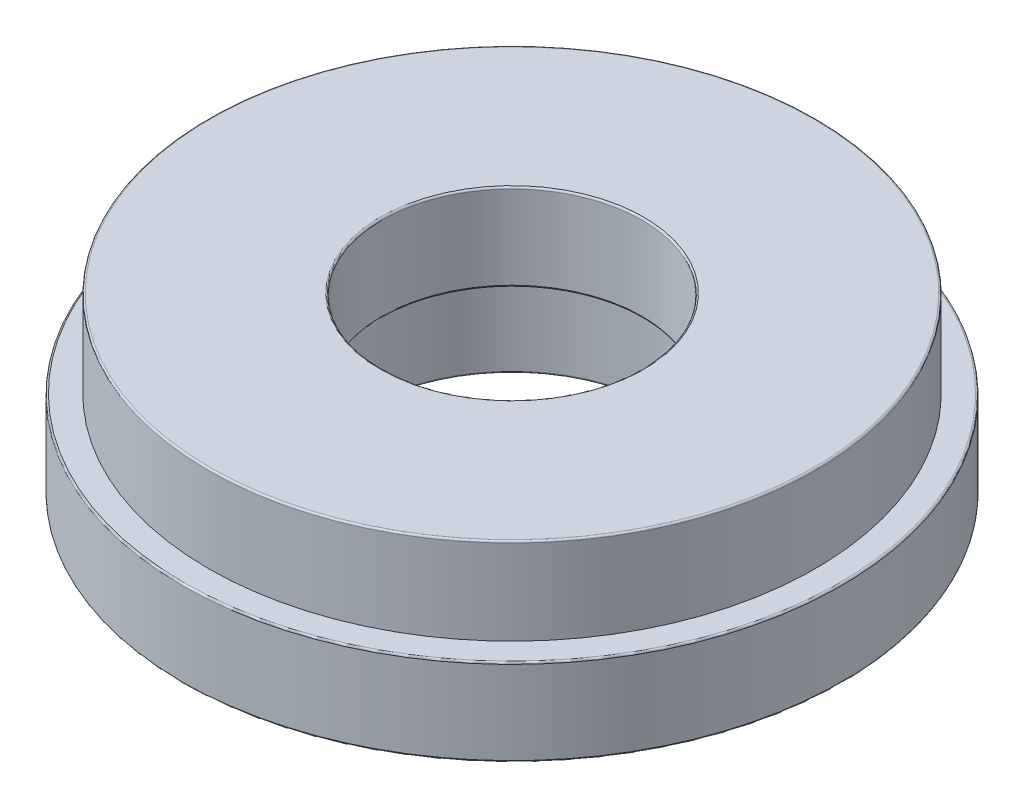
ISO-10303-21;
HEADER;
FILE_DESCRIPTION(('STEP AP214'),'2;1');
FILE_NAME('part.step','',(''),(''),'','','');
FILE_SCHEMA(('AUTOMOTIVE_DESIGN { 1 0 10303 214 1 1 1 1 }'));
ENDSEC;
DATA;
#1=APPLICATION_CONTEXT('core data for automotive mechanical design processes');
#2=APPLICATION_PROTOCOL_DEFINITION('international standard','automotive_design',2000,#1);
#3=PRODUCT_CONTEXT('',#1,'mechanical');
#4=PRODUCT('Part','Part','',(#3));
#5=PRODUCT_RELATED_PRODUCT_CATEGORY('part','',(#4));
#6=PRODUCT_DEFINITION_FORMATION('','',#4);
#7=PRODUCT_DEFINITION_CONTEXT('part definition',#1,'design');
#8=PRODUCT_DEFINITION('design','',#6,#7);
#9=PRODUCT_DEFINITION_SHAPE('','',#8);
#10=(LENGTH_UNIT() NAMED_UNIT(*) SI_UNIT(.MILLI.,.METRE.));
#11=(NAMED_UNIT(*) PLANE_ANGLE_UNIT() SI_UNIT($,.RADIAN.));
#12=(NAMED_UNIT(*) SI_UNIT($,.STERADIAN.) SOLID_ANGLE_UNIT());
#13=UNCERTAINTY_MEASURE_WITH_UNIT(LENGTH_MEASURE(1.E-05),#10,'distance_accuracy_value','');
#14=(GEOMETRIC_REPRESENTATION_CONTEXT(3) GLOBAL_UNCERTAINTY_ASSIGNED_CONTEXT((#13)) GLOBAL_UNIT_ASSIGNED_CONTEXT((#10,
#11,#12)) REPRESENTATION_CONTEXT('',''));
#15=CARTESIAN_POINT('',(0.,0.,0.));
#16=DIRECTION('',(0.,0.,1.));
#17=DIRECTION('',(1.,0.,0.));
#18=AXIS2_PLACEMENT_3D('',#15,#16,#17);
#19=CARTESIAN_POINT('',(0.,5.,0.));
#20=DIRECTION('',(0.,-1.,0.));
#21=DIRECTION('',(0.,0.,-1.));
#22=AXIS2_PLACEMENT_3D('',#19,#20,#21);
#23=CYLINDRICAL_SURFACE('',#22,19.);
#24=CARTESIAN_POINT('',(0.,0.1,0.));
#25=DIRECTION('',(0.,1.,0.));
#26=DIRECTION('',(0.,0.,1.));
#27=AXIS2_PLACEMENT_3D('',#24,#25,#26);
#28=CIRCLE('',#27,19.);
#29=CARTESIAN_POINT('',(0.,0.1,19.));
#30=VERTEX_POINT('',#29);
#31=EDGE_CURVE('E44',#30,#30,#28,.T.);
#32=ORIENTED_EDGE('',*,*,#31,.T.);
#33=EDGE_LOOP('',(#32));
#34=FACE_BOUND('',#33,.T.);
#35=CARTESIAN_POINT('',(0.,4.9,0.));
#36=DIRECTION('',(0.,1.,0.));
#37=DIRECTION('',(0.,0.,1.));
#38=AXIS2_PLACEMENT_3D('',#35,#36,#37);
#39=CIRCLE('',#38,19.);
#40=CARTESIAN_POINT('',(0.,4.9,19.));
#41=VERTEX_POINT('',#40);
#42=EDGE_CURVE('E48',#41,#41,#39,.F.);
#43=ORIENTED_EDGE('',*,*,#42,.T.);
#44=EDGE_LOOP('',(#43));
#45=FACE_BOUND('',#44,.T.);
#46=ADVANCED_FACE('F37',(#34,#45),#23,.T.);
#47=CARTESIAN_POINT('',(0.,5.,0.));
#48=DIRECTION('',(0.,1.,0.));
#49=DIRECTION('',(0.,0.,1.));
#50=AXIS2_PLACEMENT_3D('',#47,#48,#49);
#51=PLANE('',#50);
#52=CARTESIAN_POINT('',(0.,5.,0.));
#53=DIRECTION('',(0.,1.,0.));
#54=DIRECTION('',(0.,0.,1.));
#55=AXIS2_PLACEMENT_3D('',#52,#53,#54);
#56=CIRCLE('',#55,18.9);
#57=CARTESIAN_POINT('',(0.,5.,18.9));
#58=VERTEX_POINT('',#57);
#59=EDGE_CURVE('E11',#58,#58,#56,.T.);
#60=ORIENTED_EDGE('',*,*,#59,.T.);
#61=EDGE_LOOP('',(#60));
#62=FACE_BOUND('',#61,.T.);
#63=CARTESIAN_POINT('',(0.,5.,0.));
#64=DIRECTION('',(0.,1.,0.));
#65=DIRECTION('',(0.,0.,1.));
#66=AXIS2_PLACEMENT_3D('',#63,#64,#65);
#67=CIRCLE('',#66,17.5);
#68=CARTESIAN_POINT('',(0.,5.,17.5));
#69=VERTEX_POINT('',#68);
#70=EDGE_CURVE('E125',#69,#69,#67,.T.);
#71=ORIENTED_EDGE('',*,*,#70,.F.);
#72=EDGE_LOOP('',(#71));
#73=FACE_BOUND('',#72,.T.);
#74=ADVANCED_FACE('F160',(#62,#73),#51,.T.);
#75=CARTESIAN_POINT('',(0.,0.,0.));
#76=DIRECTION('',(0.,1.,0.));
#77=DIRECTION('',(0.,0.,1.));
#78=AXIS2_PLACEMENT_3D('',#75,#76,#77);
#79=PLANE('',#78);
#80=CARTESIAN_POINT('',(-12.9903810567666,0.,-7.49999999999999));
#81=DIRECTION('',(0.,1.,0.));
#82=DIRECTION('',(0.,0.,1.));
#83=AXIS2_PLACEMENT_3D('',#80,#81,#82);
#84=CIRCLE('',#83,3.2);
#85=CARTESIAN_POINT('',(-12.9903810567666,0.,-4.29999999999999));
#86=VERTEX_POINT('',#85);
#87=EDGE_CURVE('E84',#86,#86,#84,.T.);
#88=ORIENTED_EDGE('',*,*,#87,.T.);
#89=EDGE_LOOP('',(#88));
#90=FACE_BOUND('',#89,.T.);
#91=CARTESIAN_POINT('',(-12.9903810567666,0.,7.50000000000001));
#92=DIRECTION('',(0.,1.,0.));
#93=DIRECTION('',(0.,0.,1.));
#94=AXIS2_PLACEMENT_3D('',#91,#92,#93);
#95=CIRCLE('',#94,3.2);
#96=CARTESIAN_POINT('',(-12.9903810567666,0.,10.7));
#97=VERTEX_POINT('',#96);
#98=EDGE_CURVE('E87',#97,#97,#95,.T.);
#99=ORIENTED_EDGE('',*,*,#98,.T.);
#100=EDGE_LOOP('',(#99));
#101=FACE_BOUND('',#100,.T.);
#102=CARTESIAN_POINT('',(0.,0.,15.));
#103=DIRECTION('',(0.,1.,0.));
#104=DIRECTION('',(0.,0.,1.));
#105=AXIS2_PLACEMENT_3D('',#102,#103,#104);
#106=CIRCLE('',#105,3.2);
#107=CARTESIAN_POINT('',(0.,0.,18.2));
#108=VERTEX_POINT('',#107);
#109=EDGE_CURVE('E90',#108,#108,#106,.T.);
#110=ORIENTED_EDGE('',*,*,#109,.T.);
#111=EDGE_LOOP('',(#110));
#112=FACE_BOUND('',#111,.T.);
#113=CARTESIAN_POINT('',(12.9903810567666,0.,7.5));
#114=DIRECTION('',(0.,1.,0.));
#115=DIRECTION('',(0.,0.,1.));
#116=AXIS2_PLACEMENT_3D('',#113,#114,#115);
#117=CIRCLE('',#116,3.2);
#118=CARTESIAN_POINT('',(12.9903810567666,0.,10.7));
#119=VERTEX_POINT('',#118);
#120=EDGE_CURVE('E93',#119,#119,#117,.T.);
#121=ORIENTED_EDGE('',*,*,#120,.T.);
#122=EDGE_LOOP('',(#121));
#123=FACE_BOUND('',#122,.T.);
#124=CARTESIAN_POINT('',(12.9903810567666,0.,-7.50000000000001));
#125=DIRECTION('',(0.,1.,0.));
#126=DIRECTION('',(0.,0.,1.));
#127=AXIS2_PLACEMENT_3D('',#124,#125,#126);
#128=CIRCLE('',#127,3.2);
#129=CARTESIAN_POINT('',(12.9903810567666,0.,-4.30000000000001));
#130=VERTEX_POINT('',#129);
#131=EDGE_CURVE('E96',#130,#130,#128,.T.);
#132=ORIENTED_EDGE('',*,*,#131,.T.);
#133=EDGE_LOOP('',(#132));
#134=FACE_BOUND('',#133,.T.);
#135=CARTESIAN_POINT('',(0.,0.,-15.));
#136=DIRECTION('',(0.,1.,0.));
#137=DIRECTION('',(0.,0.,1.));
#138=AXIS2_PLACEMENT_3D('',#135,#136,#137);
#139=CIRCLE('',#138,3.2);
#140=CARTESIAN_POINT('',(0.,0.,-11.8));
#141=VERTEX_POINT('',#140);
#142=EDGE_CURVE('E99',#141,#141,#139,.T.);
#143=ORIENTED_EDGE('',*,*,#142,.T.);
#144=EDGE_LOOP('',(#143));
#145=FACE_BOUND('',#144,.T.);
#146=CARTESIAN_POINT('',(0.,0.,0.));
#147=DIRECTION('',(0.,1.,0.));
#148=DIRECTION('',(0.,0.,1.));
#149=AXIS2_PLACEMENT_3D('',#146,#147,#148);
#150=CIRCLE('',#149,8.6);
#151=CARTESIAN_POINT('',(0.,0.,8.6));
#152=VERTEX_POINT('',#151);
#153=EDGE_CURVE('E102',#152,#152,#150,.T.);
#154=ORIENTED_EDGE('',*,*,#153,.T.);
#155=EDGE_LOOP('',(#154));
#156=FACE_BOUND('',#155,.T.);
#157=CARTESIAN_POINT('',(0.,0.,0.));
#158=DIRECTION('',(0.,1.,0.));
#159=DIRECTION('',(0.,0.,1.));
#160=AXIS2_PLACEMENT_3D('',#157,#158,#159);
#161=CIRCLE('',#160,18.9);
#162=CARTESIAN_POINT('',(0.,0.,18.9));
#163=VERTEX_POINT('',#162);
#164=EDGE_CURVE('E105',#163,#163,#161,.F.);
#165=ORIENTED_EDGE('',*,*,#164,.T.);
#166=EDGE_LOOP('',(#165));
#167=FACE_BOUND('',#166,.T.);
#168=ADVANCED_FACE('F165',(#90,#101,#112,#123,#134,#145,#156,#167),#79,.F.);
#169=CARTESIAN_POINT('',(-12.9903810567666,4.,-7.49999999999999));
#170=DIRECTION('',(0.,-1.,0.));
#171=DIRECTION('',(0.,0.,-1.));
#172=AXIS2_PLACEMENT_3D('',#169,#170,#171);
#173=CYLINDRICAL_SURFACE('',#172,3.1);
#174=CARTESIAN_POINT('',(-12.9903810567666,0.0999999999999998,-7.49999999999999));
#175=DIRECTION('',(0.,1.,0.));
#176=DIRECTION('',(0.,0.,1.));
#177=AXIS2_PLACEMENT_3D('',#174,#175,#176);
#178=CIRCLE('',#177,3.1);
#179=CARTESIAN_POINT('',(-12.9903810567666,0.0999999999999998,-4.39999999999999));
#180=VERTEX_POINT('',#179);
#181=EDGE_CURVE('E81',#180,#180,#178,.F.);
#182=ORIENTED_EDGE('',*,*,#181,.T.);
#183=EDGE_LOOP('',(#182));
#184=FACE_BOUND('',#183,.T.);
#185=CARTESIAN_POINT('',(-12.9903810567666,4.,-7.49999999999999));
#186=DIRECTION('',(0.,1.,0.));
#187=DIRECTION('',(0.,0.,1.));
#188=AXIS2_PLACEMENT_3D('',#185,#186,#187);
#189=CIRCLE('',#188,3.1);
#190=CARTESIAN_POINT('',(-12.9903810567666,4.,-4.39999999999999));
#191=VERTEX_POINT('',#190);
#192=EDGE_CURVE('E117',#191,#191,#189,.T.);
#193=ORIENTED_EDGE('',*,*,#192,.T.);
#194=EDGE_LOOP('',(#193));
#195=FACE_BOUND('',#194,.T.);
#196=ADVANCED_FACE('F215',(#184,#195),#173,.F.);
#197=CARTESIAN_POINT('',(0.,4.,0.));
#198=DIRECTION('',(0.,1.,0.));
#199=DIRECTION('',(0.,0.,1.));
#200=AXIS2_PLACEMENT_3D('',#197,#198,#199);
#201=PLANE('',#200);
#202=ORIENTED_EDGE('',*,*,#192,.F.);
#203=EDGE_LOOP('',(#202));
#204=FACE_BOUND('',#203,.T.);
#205=ADVANCED_FACE('F220',(#204),#201,.F.);
#206=CARTESIAN_POINT('',(-12.9903810567666,4.,7.50000000000001));
#207=DIRECTION('',(0.,-1.,0.));
#208=DIRECTION('',(0.,0.,-1.));
#209=AXIS2_PLACEMENT_3D('',#206,#207,#208);
#210=CYLINDRICAL_SURFACE('',#209,3.1);
#211=CARTESIAN_POINT('',(-12.9903810567666,0.0999999999999998,7.50000000000001));
#212=DIRECTION('',(0.,1.,0.));
#213=DIRECTION('',(0.,0.,1.));
#214=AXIS2_PLACEMENT_3D('',#211,#212,#213);
#215=CIRCLE('',#214,3.1);
#216=CARTESIAN_POINT('',(-12.9903810567666,0.0999999999999998,10.6));
#217=VERTEX_POINT('',#216);
#218=EDGE_CURVE('E78',#217,#217,#215,.F.);
#219=ORIENTED_EDGE('',*,*,#218,.T.);
#220=EDGE_LOOP('',(#219));
#221=FACE_BOUND('',#220,.T.);
#222=CARTESIAN_POINT('',(-12.9903810567666,4.,7.50000000000001));
#223=DIRECTION('',(0.,1.,0.));
#224=DIRECTION('',(0.,0.,1.));
#225=AXIS2_PLACEMENT_3D('',#222,#223,#224);
#226=CIRCLE('',#225,3.1);
#227=CARTESIAN_POINT('',(-12.9903810567666,4.,10.6));
#228=VERTEX_POINT('',#227);
#229=EDGE_CURVE('E120',#228,#228,#226,.T.);
#230=ORIENTED_EDGE('',*,*,#229,.T.);
#231=EDGE_LOOP('',(#230));
#232=FACE_BOUND('',#231,.T.);
#233=ADVANCED_FACE('F247',(#221,#232),#210,.F.);
#234=CARTESIAN_POINT('',(0.,4.,0.));
#235=DIRECTION('',(0.,1.,0.));
#236=DIRECTION('',(0.,0.,1.));
#237=AXIS2_PLACEMENT_3D('',#234,#235,#236);
#238=PLANE('',#237);
#239=ORIENTED_EDGE('',*,*,#229,.F.);
#240=EDGE_LOOP('',(#239));
#241=FACE_BOUND('',#240,.T.);
#242=ADVANCED_FACE('F281',(#241),#238,.F.);
#243=CARTESIAN_POINT('',(0.,4.,15.));
#244=DIRECTION('',(0.,-1.,0.));
#245=DIRECTION('',(0.,0.,-1.));
#246=AXIS2_PLACEMENT_3D('',#243,#244,#245);
#247=CYLINDRICAL_SURFACE('',#246,3.1);
#248=CARTESIAN_POINT('',(0.,0.0999999999999998,15.));
#249=DIRECTION('',(0.,1.,0.));
#250=DIRECTION('',(0.,0.,1.));
#251=AXIS2_PLACEMENT_3D('',#248,#249,#250);
#252=CIRCLE('',#251,3.1);
#253=CARTESIAN_POINT('',(0.,0.0999999999999998,18.1));
#254=VERTEX_POINT('',#253);
#255=EDGE_CURVE('E75',#254,#254,#252,.F.);
#256=ORIENTED_EDGE('',*,*,#255,.T.);
#257=EDGE_LOOP('',(#256));
#258=FACE_BOUND('',#257,.T.);
#259=CARTESIAN_POINT('',(0.,4.,15.));
#260=DIRECTION('',(0.,1.,0.));
#261=DIRECTION('',(0.,0.,1.));
#262=AXIS2_PLACEMENT_3D('',#259,#260,#261);
#263=CIRCLE('',#262,3.1);
#264=CARTESIAN_POINT('',(0.,4.,18.1));
#265=VERTEX_POINT('',#264);
#266=EDGE_CURVE('E131',#265,#265,#263,.T.);
#267=ORIENTED_EDGE('',*,*,#266,.T.);
#268=EDGE_LOOP('',(#267));
#269=FACE_BOUND('',#268,.T.);
#270=ADVANCED_FACE('F278',(#258,#269),#247,.F.);
#271=CARTESIAN_POINT('',(0.,4.,0.));
#272=DIRECTION('',(0.,1.,0.));
#273=DIRECTION('',(0.,0.,1.));
#274=AXIS2_PLACEMENT_3D('',#271,#272,#273);
#275=PLANE('',#274);
#276=ORIENTED_EDGE('',*,*,#266,.F.);
#277=EDGE_LOOP('',(#276));
#278=FACE_BOUND('',#277,.T.);
#279=ADVANCED_FACE('F273',(#278),#275,.F.);
#280=CARTESIAN_POINT('',(12.9903810567666,4.,7.5));
#281=DIRECTION('',(0.,-1.,0.));
#282=DIRECTION('',(0.,0.,-1.));
#283=AXIS2_PLACEMENT_3D('',#280,#281,#282);
#284=CYLINDRICAL_SURFACE('',#283,3.1);
#285=CARTESIAN_POINT('',(12.9903810567666,0.0999999999999998,7.5));
#286=DIRECTION('',(0.,1.,0.));
#287=DIRECTION('',(0.,0.,1.));
#288=AXIS2_PLACEMENT_3D('',#285,#286,#287);
#289=CIRCLE('',#288,3.1);
#290=CARTESIAN_POINT('',(12.9903810567666,0.0999999999999998,10.6));
#291=VERTEX_POINT('',#290);
#292=EDGE_CURVE('E72',#291,#291,#289,.F.);
#293=ORIENTED_EDGE('',*,*,#292,.T.);
#294=EDGE_LOOP('',(#293));
#295=FACE_BOUND('',#294,.T.);
#296=CARTESIAN_POINT('',(12.9903810567666,4.,7.5));
#297=DIRECTION('',(0.,1.,0.));
#298=DIRECTION('',(0.,0.,1.));
#299=AXIS2_PLACEMENT_3D('',#296,#297,#298);
#300=CIRCLE('',#299,3.1);
#301=CARTESIAN_POINT('',(12.9903810567666,4.,10.6));
#302=VERTEX_POINT('',#301);
#303=EDGE_CURVE('E128',#302,#302,#300,.T.);
#304=ORIENTED_EDGE('',*,*,#303,.T.);
#305=EDGE_LOOP('',(#304));
#306=FACE_BOUND('',#305,.T.);
#307=ADVANCED_FACE('F270',(#295,#306),#284,.F.);
#308=CARTESIAN_POINT('',(0.,4.,0.));
#309=DIRECTION('',(0.,1.,0.));
#310=DIRECTION('',(0.,0.,1.));
#311=AXIS2_PLACEMENT_3D('',#308,#309,#310);
#312=PLANE('',#311);
#313=ORIENTED_EDGE('',*,*,#303,.F.);
#314=EDGE_LOOP('',(#313));
#315=FACE_BOUND('',#314,.T.);
#316=ADVANCED_FACE('F265',(#315),#312,.F.);
#317=CARTESIAN_POINT('',(12.9903810567666,4.,-7.50000000000001));
#318=DIRECTION('',(0.,-1.,0.));
#319=DIRECTION('',(0.,0.,-1.));
#320=AXIS2_PLACEMENT_3D('',#317,#318,#319);
#321=CYLINDRICAL_SURFACE('',#320,3.1);
#322=CARTESIAN_POINT('',(12.9903810567666,0.0999999999999998,-7.50000000000001));
#323=DIRECTION('',(0.,1.,0.));
#324=DIRECTION('',(0.,0.,1.));
#325=AXIS2_PLACEMENT_3D('',#322,#323,#324);
#326=CIRCLE('',#325,3.1);
#327=CARTESIAN_POINT('',(12.9903810567666,0.0999999999999998,-4.4));
#328=VERTEX_POINT('',#327);
#329=EDGE_CURVE('E69',#328,#328,#326,.F.);
#330=ORIENTED_EDGE('',*,*,#329,.T.);
#331=EDGE_LOOP('',(#330));
#332=FACE_BOUND('',#331,.T.);
#333=CARTESIAN_POINT('',(12.9903810567666,4.,-7.50000000000001));
#334=DIRECTION('',(0.,1.,0.));
#335=DIRECTION('',(0.,0.,1.));
#336=AXIS2_PLACEMENT_3D('',#333,#334,#335);
#337=CIRCLE('',#336,3.1);
#338=CARTESIAN_POINT('',(12.9903810567666,4.,-4.4));
#339=VERTEX_POINT('',#338);
#340=EDGE_CURVE('E124',#339,#339,#337,.T.);
#341=ORIENTED_EDGE('',*,*,#340,.T.);
#342=EDGE_LOOP('',(#341));
#343=FACE_BOUND('',#342,.T.);
#344=ADVANCED_FACE('F262',(#332,#343),#321,.F.);
#345=CARTESIAN_POINT('',(0.,4.,0.));
#346=DIRECTION('',(0.,1.,0.));
#347=DIRECTION('',(0.,0.,1.));
#348=AXIS2_PLACEMENT_3D('',#345,#346,#347);
#349=PLANE('',#348);
#350=ORIENTED_EDGE('',*,*,#340,.F.);
#351=EDGE_LOOP('',(#350));
#352=FACE_BOUND('',#351,.T.);
#353=ADVANCED_FACE('F256',(#352),#349,.F.);
#354=CARTESIAN_POINT('',(0.,4.,-15.));
#355=DIRECTION('',(0.,-1.,0.));
#356=DIRECTION('',(0.,0.,-1.));
#357=AXIS2_PLACEMENT_3D('',#354,#355,#356);
#358=CYLINDRICAL_SURFACE('',#357,3.1);
#359=CARTESIAN_POINT('',(0.,0.0999999999999998,-15.));
#360=DIRECTION('',(0.,1.,0.));
#361=DIRECTION('',(0.,0.,1.));
#362=AXIS2_PLACEMENT_3D('',#359,#360,#361);
#363=CIRCLE('',#362,3.1);
#364=CARTESIAN_POINT('',(0.,0.0999999999999998,-11.9));
#365=VERTEX_POINT('',#364);
#366=EDGE_CURVE('E66',#365,#365,#363,.F.);
#367=ORIENTED_EDGE('',*,*,#366,.T.);
#368=EDGE_LOOP('',(#367));
#369=FACE_BOUND('',#368,.T.);
#370=CARTESIAN_POINT('',(0.,4.,-15.));
#371=DIRECTION('',(0.,1.,0.));
#372=DIRECTION('',(0.,0.,1.));
#373=AXIS2_PLACEMENT_3D('',#370,#371,#372);
#374=CIRCLE('',#373,3.1);
#375=CARTESIAN_POINT('',(0.,4.,-11.9));
#376=VERTEX_POINT('',#375);
#377=EDGE_CURVE('E121',#376,#376,#374,.T.);
#378=ORIENTED_EDGE('',*,*,#377,.T.);
#379=EDGE_LOOP('',(#378));
#380=FACE_BOUND('',#379,.T.);
#381=ADVANCED_FACE('F252',(#369,#380),#358,.F.);
#382=CARTESIAN_POINT('',(0.,4.,0.));
#383=DIRECTION('',(0.,1.,0.));
#384=DIRECTION('',(0.,0.,1.));
#385=AXIS2_PLACEMENT_3D('',#382,#383,#384);
#386=PLANE('',#385);
#387=ORIENTED_EDGE('',*,*,#377,.F.);
#388=EDGE_LOOP('',(#387));
#389=FACE_BOUND('',#388,.T.);
#390=ADVANCED_FACE('F255',(#389),#386,.F.);
#391=CARTESIAN_POINT('',(0.,10.,0.));
#392=DIRECTION('',(0.,1.,0.));
#393=DIRECTION('',(0.,0.,1.));
#394=AXIS2_PLACEMENT_3D('',#391,#392,#393);
#395=PLANE('',#394);
#396=CARTESIAN_POINT('',(0.,10.,0.));
#397=DIRECTION('',(0.,1.,0.));
#398=DIRECTION('',(0.,0.,1.));
#399=AXIS2_PLACEMENT_3D('',#396,#397,#398);
#400=CIRCLE('',#399,7.6);
#401=CARTESIAN_POINT('',(0.,10.,7.6));
#402=VERTEX_POINT('',#401);
#403=EDGE_CURVE('E57',#402,#402,#400,.F.);
#404=ORIENTED_EDGE('',*,*,#403,.T.);
#405=EDGE_LOOP('',(#404));
#406=FACE_BOUND('',#405,.T.);
#407=CARTESIAN_POINT('',(0.,10.,0.));
#408=DIRECTION('',(0.,1.,0.));
#409=DIRECTION('',(0.,0.,1.));
#410=AXIS2_PLACEMENT_3D('',#407,#408,#409);
#411=CIRCLE('',#410,17.4);
#412=CARTESIAN_POINT('',(0.,10.,17.4));
#413=VERTEX_POINT('',#412);
#414=EDGE_CURVE('E60',#413,#413,#411,.T.);
#415=ORIENTED_EDGE('',*,*,#414,.T.);
#416=EDGE_LOOP('',(#415));
#417=FACE_BOUND('',#416,.T.);
#418=ADVANCED_FACE('F260',(#406,#417),#395,.T.);
#419=CARTESIAN_POINT('',(0.,10.,0.));
#420=DIRECTION('',(0.,-1.,0.));
#421=DIRECTION('',(0.,0.,-1.));
#422=AXIS2_PLACEMENT_3D('',#419,#420,#421);
#423=CYLINDRICAL_SURFACE('',#422,17.5);
#424=CARTESIAN_POINT('',(0.,9.9,0.));
#425=DIRECTION('',(0.,1.,0.));
#426=DIRECTION('',(0.,0.,1.));
#427=AXIS2_PLACEMENT_3D('',#424,#425,#426);
#428=CIRCLE('',#427,17.5);
#429=CARTESIAN_POINT('',(0.,9.9,17.5));
#430=VERTEX_POINT('',#429);
#431=EDGE_CURVE('E52',#430,#430,#428,.F.);
#432=ORIENTED_EDGE('',*,*,#431,.T.);
#433=EDGE_LOOP('',(#432));
#434=FACE_BOUND('',#433,.T.);
#435=ORIENTED_EDGE('',*,*,#70,.T.);
#436=EDGE_LOOP('',(#435));
#437=FACE_BOUND('',#436,.T.);
#438=ADVANCED_FACE('F292',(#434,#437),#423,.T.);
#439=CARTESIAN_POINT('',(0.,10.,0.));
#440=DIRECTION('',(0.,-1.,0.));
#441=DIRECTION('',(0.,0.,-1.));
#442=AXIS2_PLACEMENT_3D('',#439,#440,#441);
#443=CYLINDRICAL_SURFACE('',#442,7.5);
#444=CARTESIAN_POINT('',(0.,5.1,0.));
#445=DIRECTION('',(0.,1.,0.));
#446=DIRECTION('',(0.,0.,1.));
#447=AXIS2_PLACEMENT_3D('',#444,#445,#446);
#448=CIRCLE('',#447,7.5);
#449=CARTESIAN_POINT('',(0.,5.1,7.5));
#450=VERTEX_POINT('',#449);
#451=EDGE_CURVE('E111',#450,#450,#448,.F.);
#452=ORIENTED_EDGE('',*,*,#451,.T.);
#453=EDGE_LOOP('',(#452));
#454=FACE_BOUND('',#453,.T.);
#455=CARTESIAN_POINT('',(0.,9.9,0.));
#456=DIRECTION('',(0.,1.,0.));
#457=DIRECTION('',(0.,0.,1.));
#458=AXIS2_PLACEMENT_3D('',#455,#456,#457);
#459=CIRCLE('',#458,7.5);
#460=CARTESIAN_POINT('',(0.,9.9,7.5));
#461=VERTEX_POINT('',#460);
#462=EDGE_CURVE('E114',#461,#461,#459,.T.);
#463=ORIENTED_EDGE('',*,*,#462,.T.);
#464=EDGE_LOOP('',(#463));
#465=FACE_BOUND('',#464,.T.);
#466=ADVANCED_FACE('F156',(#454,#465),#443,.F.);
#467=CARTESIAN_POINT('',(0.,5.,0.));
#468=DIRECTION('',(0.,1.,0.));
#469=DIRECTION('',(0.,0.,1.));
#470=AXIS2_PLACEMENT_3D('',#467,#468,#469);
#471=PLANE('',#470);
#472=CARTESIAN_POINT('',(0.,5.,0.));
#473=DIRECTION('',(0.,1.,0.));
#474=DIRECTION('',(0.,0.,1.));
#475=AXIS2_PLACEMENT_3D('',#472,#473,#474);
#476=CIRCLE('',#475,7.6);
#477=CARTESIAN_POINT('',(0.,5.,7.6));
#478=VERTEX_POINT('',#477);
#479=EDGE_CURVE('E108',#478,#478,#476,.T.);
#480=ORIENTED_EDGE('',*,*,#479,.T.);
#481=EDGE_LOOP('',(#480));
#482=FACE_BOUND('',#481,.T.);
#483=CARTESIAN_POINT('',(0.,5.,0.));
#484=DIRECTION('',(0.,1.,0.));
#485=DIRECTION('',(0.,0.,1.));
#486=AXIS2_PLACEMENT_3D('',#483,#484,#485);
#487=CIRCLE('',#486,8.5);
#488=CARTESIAN_POINT('',(0.,5.,8.5));
#489=VERTEX_POINT('',#488);
#490=EDGE_CURVE('E138',#489,#489,#487,.F.);
#491=ORIENTED_EDGE('',*,*,#490,.T.);
#492=EDGE_LOOP('',(#491));
#493=FACE_BOUND('',#492,.T.);
#494=ADVANCED_FACE('F142',(#482,#493),#471,.F.);
#495=CARTESIAN_POINT('',(0.,34.0416305603426,0.));
#496=DIRECTION('',(0.,-1.,0.));
#497=DIRECTION('',(0.,0.,-1.));
#498=AXIS2_PLACEMENT_3D('',#495,#496,#497);
#499=CYLINDRICAL_SURFACE('',#498,8.5);
#500=CARTESIAN_POINT('',(0.,0.100000000000003,0.));
#501=DIRECTION('',(0.,1.,0.));
#502=DIRECTION('',(0.,0.,1.));
#503=AXIS2_PLACEMENT_3D('',#500,#501,#502);
#504=CIRCLE('',#503,8.5);
#505=CARTESIAN_POINT('',(0.,0.100000000000003,8.5));
#506=VERTEX_POINT('',#505);
#507=EDGE_CURVE('E63',#506,#506,#504,.F.);
#508=ORIENTED_EDGE('',*,*,#507,.T.);
#509=EDGE_LOOP('',(#508));
#510=FACE_BOUND('',#509,.T.);
#511=ORIENTED_EDGE('',*,*,#490,.F.);
#512=EDGE_LOOP('',(#511));
#513=FACE_BOUND('',#512,.T.);
#514=ADVANCED_FACE('F144',(#510,#513),#499,.F.);
#515=CARTESIAN_POINT('',(0.,5.1,0.));
#516=DIRECTION('',(0.,1.,0.));
#517=DIRECTION('',(0.,0.,1.));
#518=AXIS2_PLACEMENT_3D('',#515,#516,#517);
#519=TOROIDAL_SURFACE('',#518,7.6,0.1);
#520=ORIENTED_EDGE('',*,*,#479,.F.);
#521=EDGE_LOOP('',(#520));
#522=FACE_BOUND('',#521,.T.);
#523=ORIENTED_EDGE('',*,*,#451,.F.);
#524=EDGE_LOOP('',(#523));
#525=FACE_BOUND('',#524,.T.);
#526=ADVANCED_FACE('F146',(#522,#525),#519,.T.);
#527=CARTESIAN_POINT('',(-12.9903810567666,0.0999999999999998,-7.49999999999999));
#528=DIRECTION('',(0.,1.,0.));
#529=DIRECTION('',(0.,0.,1.));
#530=AXIS2_PLACEMENT_3D('',#527,#528,#529);
#531=TOROIDAL_SURFACE('',#530,3.2,0.1);
#532=ORIENTED_EDGE('',*,*,#181,.F.);
#533=EDGE_LOOP('',(#532));
#534=FACE_BOUND('',#533,.T.);
#535=ORIENTED_EDGE('',*,*,#87,.F.);
#536=EDGE_LOOP('',(#535));
#537=FACE_BOUND('',#536,.T.);
#538=ADVANCED_FACE('F153',(#534,#537),#531,.T.);
#539=CARTESIAN_POINT('',(-12.9903810567666,0.0999999999999998,7.50000000000001));
#540=DIRECTION('',(0.,1.,0.));
#541=DIRECTION('',(0.,0.,1.));
#542=AXIS2_PLACEMENT_3D('',#539,#540,#541);
#543=TOROIDAL_SURFACE('',#542,3.2,0.1);
#544=ORIENTED_EDGE('',*,*,#218,.F.);
#545=EDGE_LOOP('',(#544));
#546=FACE_BOUND('',#545,.T.);
#547=ORIENTED_EDGE('',*,*,#98,.F.);
#548=EDGE_LOOP('',(#547));
#549=FACE_BOUND('',#548,.T.);
#550=ADVANCED_FACE('F172',(#546,#549),#543,.T.);
#551=CARTESIAN_POINT('',(0.,0.0999999999999998,15.));
#552=DIRECTION('',(0.,1.,0.));
#553=DIRECTION('',(0.,0.,1.));
#554=AXIS2_PLACEMENT_3D('',#551,#552,#553);
#555=TOROIDAL_SURFACE('',#554,3.2,0.1);
#556=ORIENTED_EDGE('',*,*,#255,.F.);
#557=EDGE_LOOP('',(#556));
#558=FACE_BOUND('',#557,.T.);
#559=ORIENTED_EDGE('',*,*,#109,.F.);
#560=EDGE_LOOP('',(#559));
#561=FACE_BOUND('',#560,.T.);
#562=ADVANCED_FACE('F176',(#558,#561),#555,.T.);
#563=CARTESIAN_POINT('',(12.9903810567666,0.0999999999999998,7.5));
#564=DIRECTION('',(0.,1.,0.));
#565=DIRECTION('',(0.,0.,1.));
#566=AXIS2_PLACEMENT_3D('',#563,#564,#565);
#567=TOROIDAL_SURFACE('',#566,3.2,0.1);
#568=ORIENTED_EDGE('',*,*,#292,.F.);
#569=EDGE_LOOP('',(#568));
#570=FACE_BOUND('',#569,.T.);
#571=ORIENTED_EDGE('',*,*,#120,.F.);
#572=EDGE_LOOP('',(#571));
#573=FACE_BOUND('',#572,.T.);
#574=ADVANCED_FACE('F180',(#570,#573),#567,.T.);
#575=CARTESIAN_POINT('',(12.9903810567666,0.0999999999999998,-7.50000000000001));
#576=DIRECTION('',(0.,1.,0.));
#577=DIRECTION('',(0.,0.,1.));
#578=AXIS2_PLACEMENT_3D('',#575,#576,#577);
#579=TOROIDAL_SURFACE('',#578,3.2,0.1);
#580=ORIENTED_EDGE('',*,*,#329,.F.);
#581=EDGE_LOOP('',(#580));
#582=FACE_BOUND('',#581,.T.);
#583=ORIENTED_EDGE('',*,*,#131,.F.);
#584=EDGE_LOOP('',(#583));
#585=FACE_BOUND('',#584,.T.);
#586=ADVANCED_FACE('F184',(#582,#585),#579,.T.);
#587=CARTESIAN_POINT('',(0.,0.0999999999999998,-15.));
#588=DIRECTION('',(0.,1.,0.));
#589=DIRECTION('',(0.,0.,1.));
#590=AXIS2_PLACEMENT_3D('',#587,#588,#589);
#591=TOROIDAL_SURFACE('',#590,3.2,0.1);
#592=ORIENTED_EDGE('',*,*,#366,.F.);
#593=EDGE_LOOP('',(#592));
#594=FACE_BOUND('',#593,.T.);
#595=ORIENTED_EDGE('',*,*,#142,.F.);
#596=EDGE_LOOP('',(#595));
#597=FACE_BOUND('',#596,.T.);
#598=ADVANCED_FACE('F188',(#594,#597),#591,.T.);
#599=CARTESIAN_POINT('',(0.,0.100000000000003,0.));
#600=DIRECTION('',(0.,1.,0.));
#601=DIRECTION('',(0.,0.,1.));
#602=AXIS2_PLACEMENT_3D('',#599,#600,#601);
#603=TOROIDAL_SURFACE('',#602,8.6,0.1);
#604=ORIENTED_EDGE('',*,*,#153,.F.);
#605=EDGE_LOOP('',(#604));
#606=FACE_BOUND('',#605,.T.);
#607=ORIENTED_EDGE('',*,*,#507,.F.);
#608=EDGE_LOOP('',(#607));
#609=FACE_BOUND('',#608,.T.);
#610=ADVANCED_FACE('F192',(#606,#609),#603,.T.);
#611=CARTESIAN_POINT('',(0.,9.9,0.));
#612=DIRECTION('',(0.,1.,0.));
#613=DIRECTION('',(0.,0.,1.));
#614=AXIS2_PLACEMENT_3D('',#611,#612,#613);
#615=TOROIDAL_SURFACE('',#614,7.6,0.1);
#616=ORIENTED_EDGE('',*,*,#403,.F.);
#617=EDGE_LOOP('',(#616));
#618=FACE_BOUND('',#617,.T.);
#619=ORIENTED_EDGE('',*,*,#462,.F.);
#620=EDGE_LOOP('',(#619));
#621=FACE_BOUND('',#620,.T.);
#622=ADVANCED_FACE('F196',(#618,#621),#615,.T.);
#623=CARTESIAN_POINT('',(0.,9.9,0.));
#624=DIRECTION('',(0.,1.,0.));
#625=DIRECTION('',(0.,0.,1.));
#626=AXIS2_PLACEMENT_3D('',#623,#624,#625);
#627=TOROIDAL_SURFACE('',#626,17.4,0.1);
#628=ORIENTED_EDGE('',*,*,#431,.F.);
#629=EDGE_LOOP('',(#628));
#630=FACE_BOUND('',#629,.T.);
#631=ORIENTED_EDGE('',*,*,#414,.F.);
#632=EDGE_LOOP('',(#631));
#633=FACE_BOUND('',#632,.T.);
#634=ADVANCED_FACE('F200',(#630,#633),#627,.T.);
#635=CARTESIAN_POINT('',(0.,0.1,0.));
#636=DIRECTION('',(0.,1.,0.));
#637=DIRECTION('',(0.,0.,1.));
#638=AXIS2_PLACEMENT_3D('',#635,#636,#637);
#639=TOROIDAL_SURFACE('',#638,18.9,0.1);
#640=ORIENTED_EDGE('',*,*,#164,.F.);
#641=EDGE_LOOP('',(#640));
#642=FACE_BOUND('',#641,.T.);
#643=ORIENTED_EDGE('',*,*,#31,.F.);
#644=EDGE_LOOP('',(#643));
#645=FACE_BOUND('',#644,.T.);
#646=ADVANCED_FACE('F203',(#642,#645),#639,.T.);
#647=CARTESIAN_POINT('',(0.,4.9,0.));
#648=DIRECTION('',(0.,1.,0.));
#649=DIRECTION('',(0.,0.,1.));
#650=AXIS2_PLACEMENT_3D('',#647,#648,#649);
#651=TOROIDAL_SURFACE('',#650,18.9,0.1);
#652=ORIENTED_EDGE('',*,*,#42,.F.);
#653=EDGE_LOOP('',(#652));
#654=FACE_BOUND('',#653,.T.);
#655=ORIENTED_EDGE('',*,*,#59,.F.);
#656=EDGE_LOOP('',(#655));
#657=FACE_BOUND('',#656,.T.);
#658=ADVANCED_FACE('F39',(#654,#657),#651,.T.);
#659=CLOSED_SHELL('',(#46,#74,#168,#196,#205,#233,#242,#270,#279,#307,#316,#344,#353,#381,#390,
#418,#438,#466,#494,#514,#526,#538,#550,#562,#574,#586,#598,#610,#622,#634,#646,#658));
#660=MANIFOLD_SOLID_BREP('B2',#659);
#661=ADVANCED_BREP_SHAPE_REPRESENTATION('',(#18,#660),#14);
#662=SHAPE_DEFINITION_REPRESENTATION(#9,#661);
ENDSEC;
END-ISO-10303-21;
